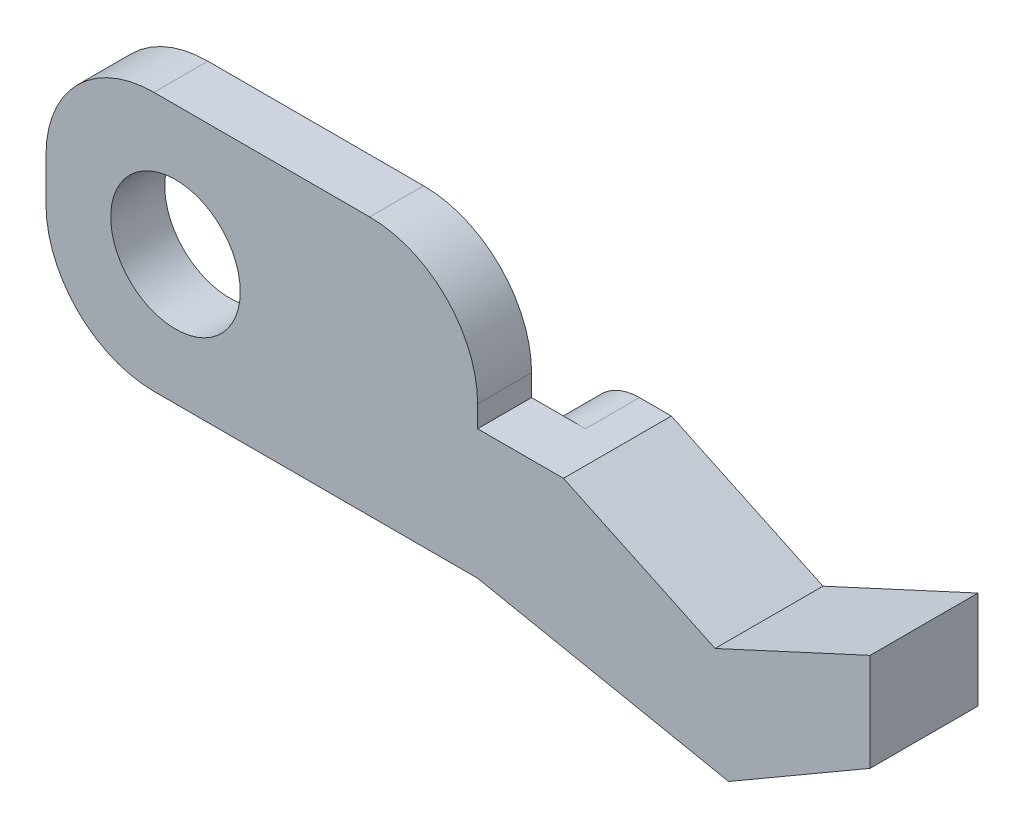
ISO-10303-21;
HEADER;
FILE_DESCRIPTION(('STEP AP214'),'2;1');
FILE_NAME('part.step','',(''),(''),'','','');
FILE_SCHEMA(('AUTOMOTIVE_DESIGN { 1 0 10303 214 1 1 1 1 }'));
ENDSEC;
DATA;
#1=APPLICATION_CONTEXT('core data for automotive mechanical design processes');
#2=APPLICATION_PROTOCOL_DEFINITION('international standard','automotive_design',2000,#1);
#3=PRODUCT_CONTEXT('',#1,'mechanical');
#4=PRODUCT('Part','Part','',(#3));
#5=PRODUCT_RELATED_PRODUCT_CATEGORY('part','',(#4));
#6=PRODUCT_DEFINITION_FORMATION('','',#4);
#7=PRODUCT_DEFINITION_CONTEXT('part definition',#1,'design');
#8=PRODUCT_DEFINITION('design','',#6,#7);
#9=PRODUCT_DEFINITION_SHAPE('','',#8);
#10=(LENGTH_UNIT() NAMED_UNIT(*) SI_UNIT(.MILLI.,.METRE.));
#11=(NAMED_UNIT(*) PLANE_ANGLE_UNIT() SI_UNIT($,.RADIAN.));
#12=(NAMED_UNIT(*) SI_UNIT($,.STERADIAN.) SOLID_ANGLE_UNIT());
#13=UNCERTAINTY_MEASURE_WITH_UNIT(LENGTH_MEASURE(1.E-05),#10,'distance_accuracy_value','');
#14=(GEOMETRIC_REPRESENTATION_CONTEXT(3) GLOBAL_UNCERTAINTY_ASSIGNED_CONTEXT((#13)) GLOBAL_UNIT_ASSIGNED_CONTEXT((#10,
#11,#12)) REPRESENTATION_CONTEXT('',''));
#15=CARTESIAN_POINT('',(0.,0.,0.));
#16=DIRECTION('',(0.,0.,1.));
#17=DIRECTION('',(1.,0.,0.));
#18=AXIS2_PLACEMENT_3D('',#15,#16,#17);
#19=CARTESIAN_POINT('',(20.,0.,0.));
#20=DIRECTION('',(1.,0.,0.));
#21=DIRECTION('',(0.,0.,-1.));
#22=AXIS2_PLACEMENT_3D('',#19,#20,#21);
#23=PLANE('',#22);
#24=DIRECTION('',(0.,1.,0.));
#25=VECTOR('',#24,1.);
#26=CARTESIAN_POINT('',(20.,-12.5,0.));
#27=LINE('',#26,#25);
#28=CARTESIAN_POINT('',(20.,0.,0.));
#29=VERTEX_POINT('',#28);
#30=CARTESIAN_POINT('',(20.,1.,0.));
#31=VERTEX_POINT('',#30);
#32=EDGE_CURVE('E320',#29,#31,#27,.T.);
#33=ORIENTED_EDGE('',*,*,#32,.T.);
#34=DIRECTION('',(0.,0.,1.));
#35=VECTOR('',#34,1.);
#36=CARTESIAN_POINT('',(20.,1.,0.));
#37=LINE('',#36,#35);
#38=CARTESIAN_POINT('',(20.,1.,2.5));
#39=VERTEX_POINT('',#38);
#40=EDGE_CURVE('E176',#31,#39,#37,.T.);
#41=ORIENTED_EDGE('',*,*,#40,.T.);
#42=DIRECTION('',(0.,1.,0.));
#43=VECTOR('',#42,1.);
#44=CARTESIAN_POINT('',(20.,0.,2.5));
#45=LINE('',#44,#43);
#46=CARTESIAN_POINT('',(20.,0.,2.5));
#47=VERTEX_POINT('',#46);
#48=EDGE_CURVE('E153',#47,#39,#45,.T.);
#49=ORIENTED_EDGE('',*,*,#48,.F.);
#50=DIRECTION('',(0.,0.,-1.));
#51=VECTOR('',#50,1.);
#52=CARTESIAN_POINT('',(20.,0.,2.5));
#53=LINE('',#52,#51);
#54=EDGE_CURVE('E163',#47,#29,#53,.T.);
#55=ORIENTED_EDGE('',*,*,#54,.T.);
#56=EDGE_LOOP('',(#33,#41,#49,#55));
#57=FACE_BOUND('',#56,.T.);
#58=ADVANCED_FACE('F32',(#57),#23,.T.);
#59=CARTESIAN_POINT('',(0.,0.,0.));
#60=DIRECTION('',(1.,0.,0.));
#61=DIRECTION('',(0.,0.,-1.));
#62=AXIS2_PLACEMENT_3D('',#59,#60,#61);
#63=PLANE('',#62);
#64=DIRECTION('',(0.,-1.,0.));
#65=VECTOR('',#64,1.);
#66=CARTESIAN_POINT('',(0.,0.,0.));
#67=LINE('',#66,#65);
#68=CARTESIAN_POINT('',(0.,1.,0.));
#69=VERTEX_POINT('',#68);
#70=CARTESIAN_POINT('',(0.,-1.,0.));
#71=VERTEX_POINT('',#70);
#72=EDGE_CURVE('E278',#69,#71,#67,.T.);
#73=ORIENTED_EDGE('',*,*,#72,.T.);
#74=DIRECTION('',(0.,0.,1.));
#75=VECTOR('',#74,1.);
#76=CARTESIAN_POINT('',(0.,-1.,2.5));
#77=LINE('',#76,#75);
#78=CARTESIAN_POINT('',(0.,-1.,2.5));
#79=VERTEX_POINT('',#78);
#80=EDGE_CURVE('E214',#71,#79,#77,.T.);
#81=ORIENTED_EDGE('',*,*,#80,.T.);
#82=DIRECTION('',(0.,1.,0.));
#83=VECTOR('',#82,1.);
#84=CARTESIAN_POINT('',(0.,0.,2.5));
#85=LINE('',#84,#83);
#86=CARTESIAN_POINT('',(0.,1.,2.5));
#87=VERTEX_POINT('',#86);
#88=EDGE_CURVE('E177',#79,#87,#85,.T.);
#89=ORIENTED_EDGE('',*,*,#88,.T.);
#90=DIRECTION('',(0.,0.,1.));
#91=VECTOR('',#90,1.);
#92=CARTESIAN_POINT('',(0.,1.,0.));
#93=LINE('',#92,#91);
#94=EDGE_CURVE('E212',#87,#69,#93,.F.);
#95=ORIENTED_EDGE('',*,*,#94,.T.);
#96=EDGE_LOOP('',(#73,#81,#89,#95));
#97=FACE_BOUND('',#96,.T.);
#98=ADVANCED_FACE('F335',(#97),#63,.F.);
#99=CARTESIAN_POINT('',(38.,7.32005996889131,2.5));
#100=DIRECTION('',(0.,0.,-1.));
#101=DIRECTION('',(0.,1.,0.));
#102=AXIS2_PLACEMENT_3D('',#99,#100,#101);
#103=PLANE('',#102);
#104=CARTESIAN_POINT('',(6.,0.,2.5));
#105=DIRECTION('',(0.,0.,1.));
#106=DIRECTION('',(1.,0.,0.));
#107=AXIS2_PLACEMENT_3D('',#104,#105,#106);
#108=CIRCLE('',#107,3.);
#109=CARTESIAN_POINT('',(9.,0.,2.5));
#110=VERTEX_POINT('',#109);
#111=EDGE_CURVE('E223',#110,#110,#108,.T.);
#112=ORIENTED_EDGE('',*,*,#111,.F.);
#113=EDGE_LOOP('',(#112));
#114=FACE_BOUND('',#113,.T.);
#115=ORIENTED_EDGE('',*,*,#48,.T.);
#116=CARTESIAN_POINT('',(15.,1.,2.5));
#117=DIRECTION('',(0.,0.,-1.));
#118=DIRECTION('',(0.,1.,0.));
#119=AXIS2_PLACEMENT_3D('',#116,#117,#118);
#120=CIRCLE('',#119,5.);
#121=CARTESIAN_POINT('',(15.,6.,2.5));
#122=VERTEX_POINT('',#121);
#123=EDGE_CURVE('E199',#39,#122,#120,.F.);
#124=ORIENTED_EDGE('',*,*,#123,.T.);
#125=DIRECTION('',(-1.,0.,0.));
#126=VECTOR('',#125,1.);
#127=CARTESIAN_POINT('',(0.,6.,2.5));
#128=LINE('',#127,#126);
#129=CARTESIAN_POINT('',(5.,6.,2.5));
#130=VERTEX_POINT('',#129);
#131=EDGE_CURVE('E367',#122,#130,#128,.T.);
#132=ORIENTED_EDGE('',*,*,#131,.T.);
#133=CARTESIAN_POINT('',(5.,1.,2.5));
#134=DIRECTION('',(0.,0.,-1.));
#135=DIRECTION('',(0.,1.,0.));
#136=AXIS2_PLACEMENT_3D('',#133,#134,#135);
#137=CIRCLE('',#136,5.);
#138=EDGE_CURVE('E195',#130,#87,#137,.F.);
#139=ORIENTED_EDGE('',*,*,#138,.T.);
#140=ORIENTED_EDGE('',*,*,#88,.F.);
#141=CARTESIAN_POINT('',(5.,-1.,2.5));
#142=DIRECTION('',(0.,0.,-1.));
#143=DIRECTION('',(0.,1.,0.));
#144=AXIS2_PLACEMENT_3D('',#141,#142,#143);
#145=CIRCLE('',#144,5.);
#146=CARTESIAN_POINT('',(5.,-6.,2.5));
#147=VERTEX_POINT('',#146);
#148=EDGE_CURVE('E197',#79,#147,#145,.F.);
#149=ORIENTED_EDGE('',*,*,#148,.T.);
#150=DIRECTION('',(1.,0.,0.));
#151=VECTOR('',#150,1.);
#152=CARTESIAN_POINT('',(0.,-6.,2.5));
#153=LINE('',#152,#151);
#154=CARTESIAN_POINT('',(20.,-6.,2.5));
#155=VERTEX_POINT('',#154);
#156=EDGE_CURVE('E222',#147,#155,#153,.T.);
#157=ORIENTED_EDGE('',*,*,#156,.T.);
#158=DIRECTION('',(0.980345854192674,-0.197286609193924,0.));
#159=VECTOR('',#158,1.);
#160=CARTESIAN_POINT('',(20.,-6.,2.5));
#161=LINE('',#160,#159);
#162=CARTESIAN_POINT('',(31.6311838602191,-8.34068090855895,2.5));
#163=VERTEX_POINT('',#162);
#164=EDGE_CURVE('E159',#155,#163,#161,.T.);
#165=ORIENTED_EDGE('',*,*,#164,.T.);
#166=DIRECTION('',(0.864897098776704,0.50194920911148,0.));
#167=VECTOR('',#166,1.);
#168=CARTESIAN_POINT('',(31.6311838602191,-8.34068090855895,2.5));
#169=LINE('',#168,#167);
#170=CARTESIAN_POINT('',(38.1873566225022,-4.5357592161625,2.5));
#171=VERTEX_POINT('',#170);
#172=EDGE_CURVE('E283',#163,#171,#169,.T.);
#173=ORIENTED_EDGE('',*,*,#172,.T.);
#174=DIRECTION('',(0.,1.,0.));
#175=VECTOR('',#174,1.);
#176=CARTESIAN_POINT('',(38.1873566225022,-4.5357592161625,2.5));
#177=LINE('',#176,#175);
#178=CARTESIAN_POINT('',(38.1873566225022,0.,2.5));
#179=VERTEX_POINT('',#178);
#180=EDGE_CURVE('E285',#171,#179,#177,.T.);
#181=ORIENTED_EDGE('',*,*,#180,.T.);
#182=DIRECTION('',(-0.90797254469666,-0.419029662526499,0.));
#183=VECTOR('',#182,1.);
#184=CARTESIAN_POINT('',(31.0044973837194,-3.314892174199,2.5));
#185=LINE('',#184,#183);
#186=CARTESIAN_POINT('',(31.0044973837194,-3.314892174199,2.5));
#187=VERTEX_POINT('',#186);
#188=EDGE_CURVE('E286',#179,#187,#185,.T.);
#189=ORIENTED_EDGE('',*,*,#188,.T.);
#190=DIRECTION('',(-0.904397584356194,0.426690765555901,0.));
#191=VECTOR('',#190,1.);
#192=CARTESIAN_POINT('',(23.9783774937306,0.,2.5));
#193=LINE('',#192,#191);
#194=CARTESIAN_POINT('',(23.9783774937306,0.,2.5));
#195=VERTEX_POINT('',#194);
#196=EDGE_CURVE('E155',#187,#195,#193,.T.);
#197=ORIENTED_EDGE('',*,*,#196,.T.);
#198=DIRECTION('',(-1.,0.,0.));
#199=VECTOR('',#198,1.);
#200=CARTESIAN_POINT('',(20.,0.,2.5));
#201=LINE('',#200,#199);
#202=EDGE_CURVE('E149',#195,#47,#201,.T.);
#203=ORIENTED_EDGE('',*,*,#202,.T.);
#204=EDGE_LOOP('',(#115,#124,#132,#139,#140,#149,#157,#165,#173,#181,#189,#197,#203));
#205=FACE_BOUND('',#204,.T.);
#206=ADVANCED_FACE('F151',(#114,#205),#103,.F.);
#207=CARTESIAN_POINT('',(40.,6.95558852676556,-2.5));
#208=DIRECTION('',(0.,0.,-1.));
#209=DIRECTION('',(0.,1.,0.));
#210=AXIS2_PLACEMENT_3D('',#207,#208,#209);
#211=PLANE('',#210);
#212=DIRECTION('',(0.,-1.,0.));
#213=VECTOR('',#212,1.);
#214=CARTESIAN_POINT('',(20.,0.,-2.5));
#215=LINE('',#214,#213);
#216=CARTESIAN_POINT('',(20.,-2.5,-2.5));
#217=VERTEX_POINT('',#216);
#218=CARTESIAN_POINT('',(20.,-3.95298417550019,-2.5));
#219=VERTEX_POINT('',#218);
#220=EDGE_CURVE('E228',#217,#219,#215,.T.);
#221=ORIENTED_EDGE('',*,*,#220,.F.);
#222=CARTESIAN_POINT('',(22.5,-2.5,-2.5));
#223=DIRECTION('',(0.,0.,-1.));
#224=DIRECTION('',(0.,1.,0.));
#225=AXIS2_PLACEMENT_3D('',#222,#223,#224);
#226=CIRCLE('',#225,2.5);
#227=CARTESIAN_POINT('',(22.5,0.,-2.5));
#228=VERTEX_POINT('',#227);
#229=EDGE_CURVE('E303',#217,#228,#226,.T.);
#230=ORIENTED_EDGE('',*,*,#229,.T.);
#231=DIRECTION('',(-1.,0.,0.));
#232=VECTOR('',#231,1.);
#233=CARTESIAN_POINT('',(20.,0.,-2.5));
#234=LINE('',#233,#232);
#235=CARTESIAN_POINT('',(23.9783774937306,0.,-2.5));
#236=VERTEX_POINT('',#235);
#237=EDGE_CURVE('E183',#236,#228,#234,.T.);
#238=ORIENTED_EDGE('',*,*,#237,.F.);
#239=DIRECTION('',(-0.904397584356194,0.426690765555901,0.));
#240=VECTOR('',#239,1.);
#241=CARTESIAN_POINT('',(23.9783774937306,0.,-2.5));
#242=LINE('',#241,#240);
#243=CARTESIAN_POINT('',(31.0044973837194,-3.314892174199,-2.5));
#244=VERTEX_POINT('',#243);
#245=EDGE_CURVE('E160',#244,#236,#242,.T.);
#246=ORIENTED_EDGE('',*,*,#245,.F.);
#247=DIRECTION('',(-0.90797254469666,-0.419029662526499,0.));
#248=VECTOR('',#247,1.);
#249=CARTESIAN_POINT('',(31.0044973837194,-3.314892174199,-2.5));
#250=LINE('',#249,#248);
#251=CARTESIAN_POINT('',(38.1873566225022,0.,-2.5));
#252=VERTEX_POINT('',#251);
#253=EDGE_CURVE('E243',#252,#244,#250,.T.);
#254=ORIENTED_EDGE('',*,*,#253,.F.);
#255=DIRECTION('',(0.,1.,0.));
#256=VECTOR('',#255,1.);
#257=CARTESIAN_POINT('',(38.1873566225022,-4.5357592161625,-2.5));
#258=LINE('',#257,#256);
#259=CARTESIAN_POINT('',(38.1873566225022,-4.5357592161625,-2.5));
#260=VERTEX_POINT('',#259);
#261=EDGE_CURVE('E241',#260,#252,#258,.T.);
#262=ORIENTED_EDGE('',*,*,#261,.F.);
#263=DIRECTION('',(0.864897098776704,0.50194920911148,0.));
#264=VECTOR('',#263,1.);
#265=CARTESIAN_POINT('',(31.6311838602191,-8.34068090855895,-2.5));
#266=LINE('',#265,#264);
#267=CARTESIAN_POINT('',(31.6311838602191,-8.34068090855895,-2.5));
#268=VERTEX_POINT('',#267);
#269=EDGE_CURVE('E239',#268,#260,#266,.T.);
#270=ORIENTED_EDGE('',*,*,#269,.F.);
#271=DIRECTION('',(0.980345854192674,-0.197286609193924,0.));
#272=VECTOR('',#271,1.);
#273=CARTESIAN_POINT('',(20.,-6.,-2.5));
#274=LINE('',#273,#272);
#275=CARTESIAN_POINT('',(22.0067834770152,-6.40384881098187,-2.5));
#276=VERTEX_POINT('',#275);
#277=EDGE_CURVE('E232',#276,#268,#274,.T.);
#278=ORIENTED_EDGE('',*,*,#277,.F.);
#279=CARTESIAN_POINT('',(22.5,-3.95298417550019,-2.5));
#280=DIRECTION('',(0.,0.,-1.));
#281=DIRECTION('',(0.,1.,0.));
#282=AXIS2_PLACEMENT_3D('',#279,#280,#281);
#283=CIRCLE('',#282,2.5);
#284=EDGE_CURVE('E306',#276,#219,#283,.T.);
#285=ORIENTED_EDGE('',*,*,#284,.T.);
#286=EDGE_LOOP('',(#221,#230,#238,#246,#254,#262,#270,#278,#285));
#287=FACE_BOUND('',#286,.T.);
#288=ADVANCED_FACE('F301',(#287),#211,.T.);
#289=CARTESIAN_POINT('',(20.,0.,2.5));
#290=DIRECTION('',(1.,0.,0.));
#291=DIRECTION('',(0.,0.,-1.));
#292=AXIS2_PLACEMENT_3D('',#289,#290,#291);
#293=PLANE('',#292);
#294=CARTESIAN_POINT('',(20.,-3.95298417550019,0.));
#295=VERTEX_POINT('',#294);
#296=CARTESIAN_POINT('',(20.,-2.5,0.));
#297=VERTEX_POINT('',#296);
#298=EDGE_CURVE('E316',#295,#297,#27,.T.);
#299=ORIENTED_EDGE('',*,*,#298,.T.);
#300=DIRECTION('',(0.,0.,1.));
#301=VECTOR('',#300,1.);
#302=CARTESIAN_POINT('',(20.,-2.5,2.5));
#303=LINE('',#302,#301);
#304=EDGE_CURVE('E310',#297,#217,#303,.F.);
#305=ORIENTED_EDGE('',*,*,#304,.T.);
#306=ORIENTED_EDGE('',*,*,#220,.T.);
#307=DIRECTION('',(0.,0.,-1.));
#308=VECTOR('',#307,1.);
#309=CARTESIAN_POINT('',(20.,-3.95298417550019,2.5));
#310=LINE('',#309,#308);
#311=EDGE_CURVE('E227',#219,#295,#310,.F.);
#312=ORIENTED_EDGE('',*,*,#311,.T.);
#313=EDGE_LOOP('',(#299,#305,#306,#312));
#314=FACE_BOUND('',#313,.T.);
#315=ADVANCED_FACE('F318',(#314),#293,.F.);
#316=CARTESIAN_POINT('',(20.,0.,2.5));
#317=DIRECTION('',(0.,-1.,0.));
#318=DIRECTION('',(0.,0.,-1.));
#319=AXIS2_PLACEMENT_3D('',#316,#317,#318);
#320=PLANE('',#319);
#321=ORIENTED_EDGE('',*,*,#237,.T.);
#322=DIRECTION('',(0.,0.,1.));
#323=VECTOR('',#322,1.);
#324=CARTESIAN_POINT('',(22.5,0.,2.5));
#325=LINE('',#324,#323);
#326=CARTESIAN_POINT('',(22.5,0.,0.));
#327=VERTEX_POINT('',#326);
#328=EDGE_CURVE('E225',#228,#327,#325,.T.);
#329=ORIENTED_EDGE('',*,*,#328,.T.);
#330=DIRECTION('',(-1.,0.,0.));
#331=VECTOR('',#330,1.);
#332=CARTESIAN_POINT('',(20.,0.,0.));
#333=LINE('',#332,#331);
#334=EDGE_CURVE('E168',#327,#29,#333,.T.);
#335=ORIENTED_EDGE('',*,*,#334,.T.);
#336=ORIENTED_EDGE('',*,*,#54,.F.);
#337=ORIENTED_EDGE('',*,*,#202,.F.);
#338=DIRECTION('',(0.,0.,-1.));
#339=VECTOR('',#338,1.);
#340=CARTESIAN_POINT('',(23.9783774937306,0.,2.5));
#341=LINE('',#340,#339);
#342=EDGE_CURVE('E246',#195,#236,#341,.T.);
#343=ORIENTED_EDGE('',*,*,#342,.T.);
#344=EDGE_LOOP('',(#321,#329,#335,#336,#337,#343));
#345=FACE_BOUND('',#344,.T.);
#346=ADVANCED_FACE('F165',(#345),#320,.F.);
#347=CARTESIAN_POINT('',(20.,-6.,2.5));
#348=DIRECTION('',(0.197286609193924,0.980345854192674,0.));
#349=DIRECTION('',(-0.980345854192674,0.197286609193924,0.));
#350=AXIS2_PLACEMENT_3D('',#347,#348,#349);
#351=PLANE('',#350);
#352=DIRECTION('',(0.980345854192674,-0.197286609193924,0.));
#353=VECTOR('',#352,1.);
#354=CARTESIAN_POINT('',(20.,-6.,0.));
#355=LINE('',#354,#353);
#356=CARTESIAN_POINT('',(20.,-6.,0.));
#357=VERTEX_POINT('',#356);
#358=CARTESIAN_POINT('',(22.0067834770152,-6.40384881098187,0.));
#359=VERTEX_POINT('',#358);
#360=EDGE_CURVE('E46',#357,#359,#355,.T.);
#361=ORIENTED_EDGE('',*,*,#360,.T.);
#362=DIRECTION('',(0.,0.,-1.));
#363=VECTOR('',#362,1.);
#364=CARTESIAN_POINT('',(22.0067834770152,-6.40384881098187,2.5));
#365=LINE('',#364,#363);
#366=EDGE_CURVE('E308',#359,#276,#365,.T.);
#367=ORIENTED_EDGE('',*,*,#366,.T.);
#368=ORIENTED_EDGE('',*,*,#277,.T.);
#369=DIRECTION('',(0.,0.,-1.));
#370=VECTOR('',#369,1.);
#371=CARTESIAN_POINT('',(31.6311838602191,-8.34068090855895,2.5));
#372=LINE('',#371,#370);
#373=EDGE_CURVE('E256',#163,#268,#372,.T.);
#374=ORIENTED_EDGE('',*,*,#373,.F.);
#375=ORIENTED_EDGE('',*,*,#164,.F.);
#376=DIRECTION('',(0.,0.,-1.));
#377=VECTOR('',#376,1.);
#378=CARTESIAN_POINT('',(20.,-6.,2.5));
#379=LINE('',#378,#377);
#380=EDGE_CURVE('E172',#155,#357,#379,.T.);
#381=ORIENTED_EDGE('',*,*,#380,.T.);
#382=EDGE_LOOP('',(#361,#367,#368,#374,#375,#381));
#383=FACE_BOUND('',#382,.T.);
#384=ADVANCED_FACE('F266',(#383),#351,.F.);
#385=CARTESIAN_POINT('',(31.6311838602191,-8.34068090855895,2.5));
#386=DIRECTION('',(-0.50194920911148,0.864897098776704,0.));
#387=DIRECTION('',(-0.864897098776704,-0.50194920911148,0.));
#388=AXIS2_PLACEMENT_3D('',#385,#386,#387);
#389=PLANE('',#388);
#390=ORIENTED_EDGE('',*,*,#269,.T.);
#391=DIRECTION('',(0.,0.,-1.));
#392=VECTOR('',#391,1.);
#393=CARTESIAN_POINT('',(38.1873566225022,-4.5357592161625,2.5));
#394=LINE('',#393,#392);
#395=EDGE_CURVE('E254',#171,#260,#394,.T.);
#396=ORIENTED_EDGE('',*,*,#395,.F.);
#397=ORIENTED_EDGE('',*,*,#172,.F.);
#398=ORIENTED_EDGE('',*,*,#373,.T.);
#399=EDGE_LOOP('',(#390,#396,#397,#398));
#400=FACE_BOUND('',#399,.T.);
#401=ADVANCED_FACE('F390',(#400),#389,.F.);
#402=CARTESIAN_POINT('',(38.1873566225022,-4.5357592161625,2.5));
#403=DIRECTION('',(-1.,0.,0.));
#404=DIRECTION('',(0.,0.,1.));
#405=AXIS2_PLACEMENT_3D('',#402,#403,#404);
#406=PLANE('',#405);
#407=ORIENTED_EDGE('',*,*,#261,.T.);
#408=DIRECTION('',(0.,0.,-1.));
#409=VECTOR('',#408,1.);
#410=CARTESIAN_POINT('',(38.1873566225022,0.,2.5));
#411=LINE('',#410,#409);
#412=EDGE_CURVE('E251',#179,#252,#411,.T.);
#413=ORIENTED_EDGE('',*,*,#412,.F.);
#414=ORIENTED_EDGE('',*,*,#180,.F.);
#415=ORIENTED_EDGE('',*,*,#395,.T.);
#416=EDGE_LOOP('',(#407,#413,#414,#415));
#417=FACE_BOUND('',#416,.T.);
#418=ADVANCED_FACE('F393',(#417),#406,.F.);
#419=CARTESIAN_POINT('',(31.0044973837194,-3.314892174199,2.5));
#420=DIRECTION('',(0.419029662526499,-0.90797254469666,0.));
#421=DIRECTION('',(0.90797254469666,0.419029662526499,0.));
#422=AXIS2_PLACEMENT_3D('',#419,#420,#421);
#423=PLANE('',#422);
#424=ORIENTED_EDGE('',*,*,#253,.T.);
#425=DIRECTION('',(0.,0.,-1.));
#426=VECTOR('',#425,1.);
#427=CARTESIAN_POINT('',(31.0044973837194,-3.314892174199,2.5));
#428=LINE('',#427,#426);
#429=EDGE_CURVE('E248',#187,#244,#428,.T.);
#430=ORIENTED_EDGE('',*,*,#429,.F.);
#431=ORIENTED_EDGE('',*,*,#188,.F.);
#432=ORIENTED_EDGE('',*,*,#412,.T.);
#433=EDGE_LOOP('',(#424,#430,#431,#432));
#434=FACE_BOUND('',#433,.T.);
#435=ADVANCED_FACE('F292',(#434),#423,.F.);
#436=CARTESIAN_POINT('',(23.9783774937306,0.,2.5));
#437=DIRECTION('',(-0.426690765555901,-0.904397584356194,0.));
#438=DIRECTION('',(0.904397584356194,-0.426690765555901,0.));
#439=AXIS2_PLACEMENT_3D('',#436,#437,#438);
#440=PLANE('',#439);
#441=ORIENTED_EDGE('',*,*,#245,.T.);
#442=ORIENTED_EDGE('',*,*,#342,.F.);
#443=ORIENTED_EDGE('',*,*,#196,.F.);
#444=ORIENTED_EDGE('',*,*,#429,.T.);
#445=EDGE_LOOP('',(#441,#442,#443,#444));
#446=FACE_BOUND('',#445,.T.);
#447=ADVANCED_FACE('F296',(#446),#440,.F.);
#448=CARTESIAN_POINT('',(-0.918612023362124,-12.5,0.));
#449=DIRECTION('',(0.,0.,1.));
#450=DIRECTION('',(1.,0.,0.));
#451=AXIS2_PLACEMENT_3D('',#448,#449,#450);
#452=PLANE('',#451);
#453=CARTESIAN_POINT('',(6.,0.,0.));
#454=DIRECTION('',(0.,0.,1.));
#455=DIRECTION('',(1.,0.,0.));
#456=AXIS2_PLACEMENT_3D('',#453,#454,#455);
#457=CIRCLE('',#456,3.);
#458=CARTESIAN_POINT('',(9.,0.,0.));
#459=VERTEX_POINT('',#458);
#460=EDGE_CURVE('E219',#459,#459,#457,.T.);
#461=ORIENTED_EDGE('',*,*,#460,.T.);
#462=EDGE_LOOP('',(#461));
#463=FACE_BOUND('',#462,.T.);
#464=DIRECTION('',(-1.,0.,0.));
#465=VECTOR('',#464,1.);
#466=CARTESIAN_POINT('',(20.,6.,0.));
#467=LINE('',#466,#465);
#468=CARTESIAN_POINT('',(15.,6.,0.));
#469=VERTEX_POINT('',#468);
#470=CARTESIAN_POINT('',(5.,6.,0.));
#471=VERTEX_POINT('',#470);
#472=EDGE_CURVE('E275',#469,#471,#467,.T.);
#473=ORIENTED_EDGE('',*,*,#472,.F.);
#474=CARTESIAN_POINT('',(15.,1.,0.));
#475=DIRECTION('',(0.,0.,1.));
#476=DIRECTION('',(1.,0.,0.));
#477=AXIS2_PLACEMENT_3D('',#474,#475,#476);
#478=CIRCLE('',#477,5.);
#479=EDGE_CURVE('E210',#469,#31,#478,.F.);
#480=ORIENTED_EDGE('',*,*,#479,.T.);
#481=ORIENTED_EDGE('',*,*,#32,.F.);
#482=ORIENTED_EDGE('',*,*,#334,.F.);
#483=CARTESIAN_POINT('',(22.5,-2.5,0.));
#484=DIRECTION('',(0.,0.,1.));
#485=DIRECTION('',(1.,0.,0.));
#486=AXIS2_PLACEMENT_3D('',#483,#484,#485);
#487=CIRCLE('',#486,2.5);
#488=EDGE_CURVE('E40',#327,#297,#487,.T.);
#489=ORIENTED_EDGE('',*,*,#488,.T.);
#490=ORIENTED_EDGE('',*,*,#298,.F.);
#491=CARTESIAN_POINT('',(22.5,-3.95298417550019,0.));
#492=DIRECTION('',(0.,0.,1.));
#493=DIRECTION('',(1.,0.,0.));
#494=AXIS2_PLACEMENT_3D('',#491,#492,#493);
#495=CIRCLE('',#494,2.5);
#496=EDGE_CURVE('E11',#295,#359,#495,.T.);
#497=ORIENTED_EDGE('',*,*,#496,.T.);
#498=ORIENTED_EDGE('',*,*,#360,.F.);
#499=DIRECTION('',(-1.,0.,0.));
#500=VECTOR('',#499,1.);
#501=CARTESIAN_POINT('',(20.,-6.,0.));
#502=LINE('',#501,#500);
#503=CARTESIAN_POINT('',(5.,-6.,0.));
#504=VERTEX_POINT('',#503);
#505=EDGE_CURVE('E271',#504,#357,#502,.F.);
#506=ORIENTED_EDGE('',*,*,#505,.F.);
#507=CARTESIAN_POINT('',(5.,-1.,0.));
#508=DIRECTION('',(0.,0.,1.));
#509=DIRECTION('',(1.,0.,0.));
#510=AXIS2_PLACEMENT_3D('',#507,#508,#509);
#511=CIRCLE('',#510,5.);
#512=EDGE_CURVE('E208',#504,#71,#511,.F.);
#513=ORIENTED_EDGE('',*,*,#512,.T.);
#514=ORIENTED_EDGE('',*,*,#72,.F.);
#515=CARTESIAN_POINT('',(5.,1.,0.));
#516=DIRECTION('',(0.,0.,1.));
#517=DIRECTION('',(1.,0.,0.));
#518=AXIS2_PLACEMENT_3D('',#515,#516,#517);
#519=CIRCLE('',#518,5.);
#520=EDGE_CURVE('E206',#69,#471,#519,.F.);
#521=ORIENTED_EDGE('',*,*,#520,.T.);
#522=EDGE_LOOP('',(#473,#480,#481,#482,#489,#490,#497,#498,#506,#513,#514,#521));
#523=FACE_BOUND('',#522,.T.);
#524=ADVANCED_FACE('F315',(#463,#523),#452,.F.);
#525=CARTESIAN_POINT('',(0.,-6.,0.));
#526=DIRECTION('',(0.,-1.,0.));
#527=DIRECTION('',(0.,0.,-1.));
#528=AXIS2_PLACEMENT_3D('',#525,#526,#527);
#529=PLANE('',#528);
#530=ORIENTED_EDGE('',*,*,#156,.F.);
#531=DIRECTION('',(0.,0.,1.));
#532=VECTOR('',#531,1.);
#533=CARTESIAN_POINT('',(5.,-6.,0.));
#534=LINE('',#533,#532);
#535=EDGE_CURVE('E217',#147,#504,#534,.F.);
#536=ORIENTED_EDGE('',*,*,#535,.T.);
#537=ORIENTED_EDGE('',*,*,#505,.T.);
#538=ORIENTED_EDGE('',*,*,#380,.F.);
#539=EDGE_LOOP('',(#530,#536,#537,#538));
#540=FACE_BOUND('',#539,.T.);
#541=ADVANCED_FACE('F272',(#540),#529,.T.);
#542=CARTESIAN_POINT('',(0.,6.,0.));
#543=DIRECTION('',(0.,1.,0.));
#544=DIRECTION('',(0.,0.,1.));
#545=AXIS2_PLACEMENT_3D('',#542,#543,#544);
#546=PLANE('',#545);
#547=ORIENTED_EDGE('',*,*,#131,.F.);
#548=DIRECTION('',(0.,0.,1.));
#549=VECTOR('',#548,1.);
#550=CARTESIAN_POINT('',(15.,6.,0.));
#551=LINE('',#550,#549);
#552=EDGE_CURVE('E204',#122,#469,#551,.F.);
#553=ORIENTED_EDGE('',*,*,#552,.T.);
#554=ORIENTED_EDGE('',*,*,#472,.T.);
#555=DIRECTION('',(0.,0.,1.));
#556=VECTOR('',#555,1.);
#557=CARTESIAN_POINT('',(5.,6.,2.5));
#558=LINE('',#557,#556);
#559=EDGE_CURVE('E201',#471,#130,#558,.T.);
#560=ORIENTED_EDGE('',*,*,#559,.T.);
#561=EDGE_LOOP('',(#547,#553,#554,#560));
#562=FACE_BOUND('',#561,.T.);
#563=ADVANCED_FACE('F349',(#562),#546,.T.);
#564=CARTESIAN_POINT('',(15.,1.,0.));
#565=DIRECTION('',(0.,0.,1.));
#566=DIRECTION('',(1.,0.,0.));
#567=AXIS2_PLACEMENT_3D('',#564,#565,#566);
#568=CYLINDRICAL_SURFACE('',#567,5.);
#569=ORIENTED_EDGE('',*,*,#479,.F.);
#570=ORIENTED_EDGE('',*,*,#552,.F.);
#571=ORIENTED_EDGE('',*,*,#123,.F.);
#572=ORIENTED_EDGE('',*,*,#40,.F.);
#573=EDGE_LOOP('',(#569,#570,#571,#572));
#574=FACE_BOUND('',#573,.T.);
#575=ADVANCED_FACE('F345',(#574),#568,.T.);
#576=CARTESIAN_POINT('',(5.,-1.,0.));
#577=DIRECTION('',(0.,0.,-1.));
#578=DIRECTION('',(-1.,0.,0.));
#579=AXIS2_PLACEMENT_3D('',#576,#577,#578);
#580=CYLINDRICAL_SURFACE('',#579,5.);
#581=ORIENTED_EDGE('',*,*,#512,.F.);
#582=ORIENTED_EDGE('',*,*,#535,.F.);
#583=ORIENTED_EDGE('',*,*,#148,.F.);
#584=ORIENTED_EDGE('',*,*,#80,.F.);
#585=EDGE_LOOP('',(#581,#582,#583,#584));
#586=FACE_BOUND('',#585,.T.);
#587=ADVANCED_FACE('F348',(#586),#580,.T.);
#588=CARTESIAN_POINT('',(5.,1.,0.));
#589=DIRECTION('',(0.,0.,-1.));
#590=DIRECTION('',(-1.,0.,0.));
#591=AXIS2_PLACEMENT_3D('',#588,#589,#590);
#592=CYLINDRICAL_SURFACE('',#591,5.);
#593=ORIENTED_EDGE('',*,*,#520,.F.);
#594=ORIENTED_EDGE('',*,*,#94,.F.);
#595=ORIENTED_EDGE('',*,*,#138,.F.);
#596=ORIENTED_EDGE('',*,*,#559,.F.);
#597=EDGE_LOOP('',(#593,#594,#595,#596));
#598=FACE_BOUND('',#597,.T.);
#599=ADVANCED_FACE('F330',(#598),#592,.T.);
#600=CARTESIAN_POINT('',(6.,0.,-4.));
#601=DIRECTION('',(0.,0.,1.));
#602=DIRECTION('',(1.,0.,0.));
#603=AXIS2_PLACEMENT_3D('',#600,#601,#602);
#604=CYLINDRICAL_SURFACE('',#603,3.);
#605=ORIENTED_EDGE('',*,*,#111,.T.);
#606=EDGE_LOOP('',(#605));
#607=FACE_BOUND('',#606,.T.);
#608=ORIENTED_EDGE('',*,*,#460,.F.);
#609=EDGE_LOOP('',(#608));
#610=FACE_BOUND('',#609,.T.);
#611=ADVANCED_FACE('F324',(#607,#610),#604,.F.);
#612=CARTESIAN_POINT('',(22.5,-2.5,2.5));
#613=DIRECTION('',(0.,0.,1.));
#614=DIRECTION('',(1.,0.,0.));
#615=AXIS2_PLACEMENT_3D('',#612,#613,#614);
#616=CYLINDRICAL_SURFACE('',#615,2.5);
#617=ORIENTED_EDGE('',*,*,#229,.F.);
#618=ORIENTED_EDGE('',*,*,#304,.F.);
#619=ORIENTED_EDGE('',*,*,#488,.F.);
#620=ORIENTED_EDGE('',*,*,#328,.F.);
#621=EDGE_LOOP('',(#617,#618,#619,#620));
#622=FACE_BOUND('',#621,.T.);
#623=ADVANCED_FACE('F322',(#622),#616,.T.);
#624=CARTESIAN_POINT('',(22.5,-3.95298417550019,2.5));
#625=DIRECTION('',(0.,0.,-1.));
#626=DIRECTION('',(-1.,0.,0.));
#627=AXIS2_PLACEMENT_3D('',#624,#625,#626);
#628=CYLINDRICAL_SURFACE('',#627,2.5);
#629=ORIENTED_EDGE('',*,*,#496,.F.);
#630=ORIENTED_EDGE('',*,*,#311,.F.);
#631=ORIENTED_EDGE('',*,*,#284,.F.);
#632=ORIENTED_EDGE('',*,*,#366,.F.);
#633=EDGE_LOOP('',(#629,#630,#631,#632));
#634=FACE_BOUND('',#633,.T.);
#635=ADVANCED_FACE('F34',(#634),#628,.T.);
#636=CLOSED_SHELL('',(#58,#98,#206,#288,#315,#346,#384,#401,#418,#435,#447,#524,#541,#563,#575,
#587,#599,#611,#623,#635));
#637=MANIFOLD_SOLID_BREP('B2',#636);
#638=ADVANCED_BREP_SHAPE_REPRESENTATION('',(#18,#637),#14);
#639=SHAPE_DEFINITION_REPRESENTATION(#9,#638);
ENDSEC;
END-ISO-10303-21;
